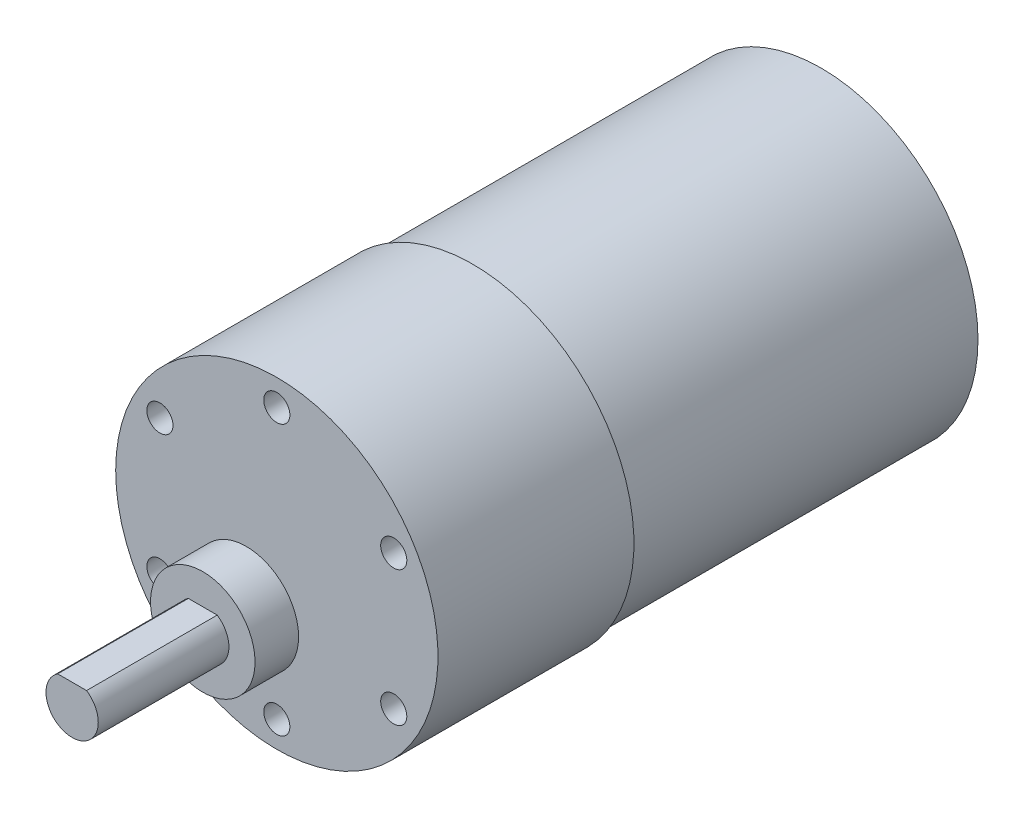
ISO-10303-21;
HEADER;
FILE_DESCRIPTION(('STEP AP214'),'2;1');
FILE_NAME('part.step','',(''),(''),'','','');
FILE_SCHEMA(('AUTOMOTIVE_DESIGN { 1 0 10303 214 1 1 1 1 }'));
ENDSEC;
DATA;
#1=APPLICATION_CONTEXT('core data for automotive mechanical design processes');
#2=APPLICATION_PROTOCOL_DEFINITION('international standard','automotive_design',2000,#1);
#3=PRODUCT_CONTEXT('',#1,'mechanical');
#4=PRODUCT('Part','Part','',(#3));
#5=PRODUCT_RELATED_PRODUCT_CATEGORY('part','',(#4));
#6=PRODUCT_DEFINITION_FORMATION('','',#4);
#7=PRODUCT_DEFINITION_CONTEXT('part definition',#1,'design');
#8=PRODUCT_DEFINITION('design','',#6,#7);
#9=PRODUCT_DEFINITION_SHAPE('','',#8);
#10=(LENGTH_UNIT() NAMED_UNIT(*) SI_UNIT(.MILLI.,.METRE.));
#11=(NAMED_UNIT(*) PLANE_ANGLE_UNIT() SI_UNIT($,.RADIAN.));
#12=(NAMED_UNIT(*) SI_UNIT($,.STERADIAN.) SOLID_ANGLE_UNIT());
#13=UNCERTAINTY_MEASURE_WITH_UNIT(LENGTH_MEASURE(1.E-05),#10,'distance_accuracy_value','');
#14=(GEOMETRIC_REPRESENTATION_CONTEXT(3) GLOBAL_UNCERTAINTY_ASSIGNED_CONTEXT((#13)) GLOBAL_UNIT_ASSIGNED_CONTEXT((#10,
#11,#12)) REPRESENTATION_CONTEXT('',''));
#15=CARTESIAN_POINT('',(0.,0.,0.));
#16=DIRECTION('',(0.,0.,1.));
#17=DIRECTION('',(1.,0.,0.));
#18=AXIS2_PLACEMENT_3D('',#15,#16,#17);
#19=CARTESIAN_POINT('',(-3.50000000000001,-6.06217782649107,27.5));
#20=DIRECTION('',(0.,0.,1.));
#21=DIRECTION('',(1.,0.,0.));
#22=AXIS2_PLACEMENT_3D('',#19,#20,#21);
#23=PLANE('',#22);
#24=CARTESIAN_POINT('',(-3.50000000000001,-6.06217782649107,27.5));
#25=DIRECTION('',(0.,0.,1.));
#26=DIRECTION('',(1.,0.,0.));
#27=AXIS2_PLACEMENT_3D('',#24,#25,#26);
#28=CIRCLE('',#27,6.);
#29=CARTESIAN_POINT('',(2.49999999999999,-6.06217782649107,27.5));
#30=VERTEX_POINT('',#29);
#31=EDGE_CURVE('E81',#30,#30,#28,.T.);
#32=ORIENTED_EDGE('',*,*,#31,.T.);
#33=EDGE_LOOP('',(#32));
#34=FACE_BOUND('',#33,.T.);
#35=DIRECTION('',(1.,0.,0.));
#36=VECTOR('',#35,1.);
#37=CARTESIAN_POINT('',(-3.50000000000001,-3.56217782649107,27.5));
#38=LINE('',#37,#36);
#39=CARTESIAN_POINT('',(-5.15831239517771,-3.56217782649107,27.5));
#40=VERTEX_POINT('',#39);
#41=CARTESIAN_POINT('',(-1.8416876048223,-3.56217782649107,27.5));
#42=VERTEX_POINT('',#41);
#43=EDGE_CURVE('E48',#40,#42,#38,.T.);
#44=ORIENTED_EDGE('',*,*,#43,.T.);
#45=CARTESIAN_POINT('',(-3.50000000000001,-6.06217782649107,27.5));
#46=DIRECTION('',(0.,0.,1.));
#47=DIRECTION('',(1.,0.,0.));
#48=AXIS2_PLACEMENT_3D('',#45,#46,#47);
#49=CIRCLE('',#48,3.);
#50=EDGE_CURVE('E11',#42,#40,#49,.F.);
#51=ORIENTED_EDGE('',*,*,#50,.T.);
#52=EDGE_LOOP('',(#44,#51));
#53=FACE_BOUND('',#52,.T.);
#54=ADVANCED_FACE('F39',(#34,#53),#23,.T.);
#55=CARTESIAN_POINT('',(0.,0.,-40.));
#56=DIRECTION('',(0.,0.,1.));
#57=DIRECTION('',(1.,0.,0.));
#58=AXIS2_PLACEMENT_3D('',#55,#56,#57);
#59=CYLINDRICAL_SURFACE('',#58,18.);
#60=CARTESIAN_POINT('',(0.,0.,-40.));
#61=DIRECTION('',(0.,0.,1.));
#62=DIRECTION('',(1.,0.,0.));
#63=AXIS2_PLACEMENT_3D('',#60,#61,#62);
#64=CIRCLE('',#63,18.);
#65=CARTESIAN_POINT('',(18.,0.,-40.));
#66=VERTEX_POINT('',#65);
#67=EDGE_CURVE('E94',#66,#66,#64,.T.);
#68=ORIENTED_EDGE('',*,*,#67,.T.);
#69=EDGE_LOOP('',(#68));
#70=FACE_BOUND('',#69,.T.);
#71=CARTESIAN_POINT('',(0.,0.,0.));
#72=DIRECTION('',(0.,0.,1.));
#73=DIRECTION('',(1.,0.,0.));
#74=AXIS2_PLACEMENT_3D('',#71,#72,#73);
#75=CIRCLE('',#74,18.);
#76=CARTESIAN_POINT('',(18.,0.,0.));
#77=VERTEX_POINT('',#76);
#78=EDGE_CURVE('E99',#77,#77,#75,.T.);
#79=ORIENTED_EDGE('',*,*,#78,.F.);
#80=EDGE_LOOP('',(#79));
#81=FACE_BOUND('',#80,.T.);
#82=ADVANCED_FACE('F41',(#70,#81),#59,.T.);
#83=CARTESIAN_POINT('',(0.,0.,-40.));
#84=DIRECTION('',(0.,0.,1.));
#85=DIRECTION('',(1.,0.,0.));
#86=AXIS2_PLACEMENT_3D('',#83,#84,#85);
#87=PLANE('',#86);
#88=ORIENTED_EDGE('',*,*,#67,.F.);
#89=EDGE_LOOP('',(#88));
#90=FACE_BOUND('',#89,.T.);
#91=ADVANCED_FACE('F116',(#90),#87,.F.);
#92=CARTESIAN_POINT('',(0.,0.,22.5));
#93=DIRECTION('',(0.,0.,-1.));
#94=DIRECTION('',(-1.,0.,0.));
#95=AXIS2_PLACEMENT_3D('',#92,#93,#94);
#96=CYLINDRICAL_SURFACE('',#95,18.5);
#97=CARTESIAN_POINT('',(0.,0.,22.5));
#98=DIRECTION('',(0.,0.,1.));
#99=DIRECTION('',(1.,0.,0.));
#100=AXIS2_PLACEMENT_3D('',#97,#98,#99);
#101=CIRCLE('',#100,18.5);
#102=CARTESIAN_POINT('',(-18.5,0.,22.5));
#103=VERTEX_POINT('',#102);
#104=EDGE_CURVE('E95',#103,#103,#101,.T.);
#105=CARTESIAN_POINT('',(0.,0.,0.));
#106=DIRECTION('',(0.,0.,1.));
#107=DIRECTION('',(1.,0.,0.));
#108=AXIS2_PLACEMENT_3D('',#105,#106,#107);
#109=CIRCLE('',#108,18.5);
#110=CARTESIAN_POINT('',(-18.5,0.,0.));
#111=VERTEX_POINT('',#110);
#112=EDGE_CURVE('E86',#111,#111,#109,.T.);
#113=CARTESIAN_POINT('',(-18.5,0.,22.5));
#114=CARTESIAN_POINT('',(-18.5,0.,22.265625));
#115=CARTESIAN_POINT('',(-18.5,0.,22.03125));
#116=CARTESIAN_POINT('',(-18.5,0.,21.5625));
#117=CARTESIAN_POINT('',(-18.5,0.,21.328125));
#118=CARTESIAN_POINT('',(-18.5,0.,20.859375));
#119=CARTESIAN_POINT('',(-18.5,0.,20.625));
#120=CARTESIAN_POINT('',(-18.5,0.,20.15625));
#121=CARTESIAN_POINT('',(-18.5,0.,19.921875));
#122=CARTESIAN_POINT('',(-18.5,0.,19.453125));
#123=CARTESIAN_POINT('',(-18.5,0.,19.21875));
#124=CARTESIAN_POINT('',(-18.5,0.,18.75));
#125=CARTESIAN_POINT('',(-18.5,0.,18.515625));
#126=CARTESIAN_POINT('',(-18.5,0.,18.046875));
#127=CARTESIAN_POINT('',(-18.5,0.,17.8125));
#128=CARTESIAN_POINT('',(-18.5,0.,17.34375));
#129=CARTESIAN_POINT('',(-18.5,0.,17.109375));
#130=CARTESIAN_POINT('',(-18.5,0.,16.640625));
#131=CARTESIAN_POINT('',(-18.5,0.,16.40625));
#132=CARTESIAN_POINT('',(-18.5,0.,15.9375));
#133=CARTESIAN_POINT('',(-18.5,0.,15.703125));
#134=CARTESIAN_POINT('',(-18.5,0.,15.234375));
#135=CARTESIAN_POINT('',(-18.5,0.,15.));
#136=CARTESIAN_POINT('',(-18.5,0.,14.53125));
#137=CARTESIAN_POINT('',(-18.5,0.,14.296875));
#138=CARTESIAN_POINT('',(-18.5,0.,13.828125));
#139=CARTESIAN_POINT('',(-18.5,0.,13.59375));
#140=CARTESIAN_POINT('',(-18.5,0.,13.125));
#141=CARTESIAN_POINT('',(-18.5,0.,12.890625));
#142=CARTESIAN_POINT('',(-18.5,0.,12.421875));
#143=CARTESIAN_POINT('',(-18.5,0.,12.1875));
#144=CARTESIAN_POINT('',(-18.5,0.,11.71875));
#145=CARTESIAN_POINT('',(-18.5,0.,11.484375));
#146=CARTESIAN_POINT('',(-18.5,0.,11.015625));
#147=CARTESIAN_POINT('',(-18.5,0.,10.78125));
#148=CARTESIAN_POINT('',(-18.5,0.,10.3125));
#149=CARTESIAN_POINT('',(-18.5,0.,10.078125));
#150=CARTESIAN_POINT('',(-18.5,0.,9.60937499999999));
#151=CARTESIAN_POINT('',(-18.5,0.,9.375));
#152=CARTESIAN_POINT('',(-18.5,0.,8.90625));
#153=CARTESIAN_POINT('',(-18.5,0.,8.671875));
#154=CARTESIAN_POINT('',(-18.5,0.,8.20312499999999));
#155=CARTESIAN_POINT('',(-18.5,0.,7.96874999999999));
#156=CARTESIAN_POINT('',(-18.5,0.,7.5));
#157=CARTESIAN_POINT('',(-18.5,0.,7.265625));
#158=CARTESIAN_POINT('',(-18.5,0.,6.796875));
#159=CARTESIAN_POINT('',(-18.5,0.,6.5625));
#160=CARTESIAN_POINT('',(-18.5,0.,6.09375));
#161=CARTESIAN_POINT('',(-18.5,0.,5.859375));
#162=CARTESIAN_POINT('',(-18.5,0.,5.390625));
#163=CARTESIAN_POINT('',(-18.5,0.,5.15625));
#164=CARTESIAN_POINT('',(-18.5,0.,4.6875));
#165=CARTESIAN_POINT('',(-18.5,0.,4.453125));
#166=CARTESIAN_POINT('',(-18.5,0.,3.984375));
#167=CARTESIAN_POINT('',(-18.5,0.,3.75));
#168=CARTESIAN_POINT('',(-18.5,0.,3.28125));
#169=CARTESIAN_POINT('',(-18.5,0.,3.046875));
#170=CARTESIAN_POINT('',(-18.5,0.,2.578125));
#171=CARTESIAN_POINT('',(-18.5,0.,2.34375));
#172=CARTESIAN_POINT('',(-18.5,0.,1.875));
#173=CARTESIAN_POINT('',(-18.5,0.,1.640625));
#174=CARTESIAN_POINT('',(-18.5,0.,1.171875));
#175=CARTESIAN_POINT('',(-18.5,0.,0.937499999999996));
#176=CARTESIAN_POINT('',(-18.5,0.,0.468749999999996));
#177=CARTESIAN_POINT('',(-18.5,0.,0.234374999999996));
#178=CARTESIAN_POINT('',(-18.5,0.,0.));
#179=B_SPLINE_CURVE_WITH_KNOTS('',3,(#113,#114,#115,#116,#117,#118,#119,#120,#121,#122,#123,
#124,#125,#126,#127,#128,#129,#130,#131,#132,#133,#134,#135,#136,#137,#138,#139,#140,#141,#142,
#143,#144,#145,#146,#147,#148,#149,#150,#151,#152,#153,#154,#155,#156,#157,#158,#159,#160,#161,
#162,#163,#164,#165,#166,#167,#168,#169,#170,#171,#172,#173,#174,#175,#176,#177,#178),
.UNSPECIFIED.,.F.,.F.,(4,2,2,2,2,2,2,2,2,2,2,2,2,2,2,2,2,2,2,2,2,2,2,2,2,2,2,2,2,2,2,2,4),(0.,
0.703125000000002,1.40625,2.109375,2.8125,3.515625,4.21875,4.921875,5.625,6.328125,7.03125,
7.734375,8.4375,9.140625,9.84375,10.546875,11.25,11.953125,12.65625,13.359375,14.0625,14.765625,
15.46875,16.171875,16.875,17.578125,18.28125,18.984375,19.6875,20.390625,21.09375,21.796875,
22.5),.UNSPECIFIED.);
#180=EDGE_CURVE('BSEAM129',#103,#111,#179,.T.);
#181=ORIENTED_EDGE('',*,*,#104,.F.);
#182=ORIENTED_EDGE('',*,*,#112,.T.);
#183=ORIENTED_EDGE('',*,*,#180,.T.);
#184=ORIENTED_EDGE('',*,*,#180,.F.);
#185=EDGE_LOOP('',(#181,#183,#182,#184));
#186=FACE_BOUND('',#185,.T.);
#187=ADVANCED_FACE('F129',(#186),#96,.T.);
#188=CARTESIAN_POINT('',(0.,0.,22.5));
#189=DIRECTION('',(0.,0.,1.));
#190=DIRECTION('',(1.,0.,0.));
#191=AXIS2_PLACEMENT_3D('',#188,#189,#190);
#192=PLANE('',#191);
#193=CARTESIAN_POINT('',(13.4233937586587,7.75000000000016,22.5));
#194=DIRECTION('',(0.,0.,1.));
#195=DIRECTION('',(0.50000000000001,-0.866025403784433,0.));
#196=AXIS2_PLACEMENT_3D('',#193,#194,#195);
#197=CIRCLE('',#196,1.5);
#198=CARTESIAN_POINT('',(14.1733937586587,6.45096189432351,22.5));
#199=VERTEX_POINT('',#198);
#200=EDGE_CURVE('E331',#199,#199,#197,.T.);
#201=ORIENTED_EDGE('',*,*,#200,.F.);
#202=EDGE_LOOP('',(#201));
#203=FACE_BOUND('',#202,.T.);
#204=CARTESIAN_POINT('',(13.4233937586589,-7.74999999999987,22.5));
#205=DIRECTION('',(0.,0.,1.));
#206=DIRECTION('',(-0.499999999999992,-0.866025403784443,0.));
#207=AXIS2_PLACEMENT_3D('',#204,#205,#206);
#208=CIRCLE('',#207,1.5);
#209=CARTESIAN_POINT('',(12.6733937586589,-9.04903810567654,22.5));
#210=VERTEX_POINT('',#209);
#211=EDGE_CURVE('E330',#210,#210,#208,.T.);
#212=ORIENTED_EDGE('',*,*,#211,.F.);
#213=EDGE_LOOP('',(#212));
#214=FACE_BOUND('',#213,.T.);
#215=CARTESIAN_POINT('',(0.,-15.5,22.5));
#216=DIRECTION('',(0.,0.,1.));
#217=DIRECTION('',(-1.,0.,0.));
#218=AXIS2_PLACEMENT_3D('',#215,#216,#217);
#219=CIRCLE('',#218,1.5);
#220=CARTESIAN_POINT('',(-1.5,-15.5,22.5));
#221=VERTEX_POINT('',#220);
#222=EDGE_CURVE('E376',#221,#221,#219,.T.);
#223=ORIENTED_EDGE('',*,*,#222,.F.);
#224=EDGE_LOOP('',(#223));
#225=FACE_BOUND('',#224,.T.);
#226=CARTESIAN_POINT('',(-13.4233937586588,-7.75000000000006,22.5));
#227=DIRECTION('',(0.,0.,1.));
#228=DIRECTION('',(-0.500000000000004,0.866025403784436,0.));
#229=AXIS2_PLACEMENT_3D('',#226,#227,#228);
#230=CIRCLE('',#229,1.5);
#231=CARTESIAN_POINT('',(-14.1733937586588,-6.45096189432341,22.5));
#232=VERTEX_POINT('',#231);
#233=EDGE_CURVE('E368',#232,#232,#230,.T.);
#234=ORIENTED_EDGE('',*,*,#233,.F.);
#235=EDGE_LOOP('',(#234));
#236=FACE_BOUND('',#235,.T.);
#237=CARTESIAN_POINT('',(-13.4233937586588,7.74999999999997,22.5));
#238=DIRECTION('',(0.,0.,1.));
#239=DIRECTION('',(0.499999999999998,0.86602540378444,0.));
#240=AXIS2_PLACEMENT_3D('',#237,#238,#239);
#241=CIRCLE('',#240,1.5);
#242=CARTESIAN_POINT('',(-12.6733937586588,9.04903810567663,22.5));
#243=VERTEX_POINT('',#242);
#244=EDGE_CURVE('E347',#243,#243,#241,.T.);
#245=ORIENTED_EDGE('',*,*,#244,.F.);
#246=EDGE_LOOP('',(#245));
#247=FACE_BOUND('',#246,.T.);
#248=CARTESIAN_POINT('',(0.,15.5,22.5));
#249=DIRECTION('',(0.,0.,1.));
#250=DIRECTION('',(1.,0.,0.));
#251=AXIS2_PLACEMENT_3D('',#248,#249,#250);
#252=CIRCLE('',#251,1.5);
#253=CARTESIAN_POINT('',(1.5,15.5,22.5));
#254=VERTEX_POINT('',#253);
#255=EDGE_CURVE('E346',#254,#254,#252,.T.);
#256=ORIENTED_EDGE('',*,*,#255,.F.);
#257=EDGE_LOOP('',(#256));
#258=FACE_BOUND('',#257,.T.);
#259=CARTESIAN_POINT('',(-3.50000000000001,-6.06217782649107,22.5));
#260=DIRECTION('',(0.,0.,1.));
#261=DIRECTION('',(1.,0.,0.));
#262=AXIS2_PLACEMENT_3D('',#259,#260,#261);
#263=CIRCLE('',#262,6.);
#264=CARTESIAN_POINT('',(2.49999999999999,-6.06217782649107,22.5));
#265=VERTEX_POINT('',#264);
#266=EDGE_CURVE('E90',#265,#265,#263,.T.);
#267=ORIENTED_EDGE('',*,*,#266,.F.);
#268=EDGE_LOOP('',(#267));
#269=FACE_BOUND('',#268,.T.);
#270=ORIENTED_EDGE('',*,*,#104,.T.);
#271=EDGE_LOOP('',(#270));
#272=FACE_BOUND('',#271,.T.);
#273=ADVANCED_FACE('F126',(#203,#214,#225,#236,#247,#258,#269,#272),#192,.T.);
#274=CARTESIAN_POINT('',(0.,0.,0.));
#275=DIRECTION('',(0.,0.,1.));
#276=DIRECTION('',(1.,0.,0.));
#277=AXIS2_PLACEMENT_3D('',#274,#275,#276);
#278=PLANE('',#277);
#279=ORIENTED_EDGE('',*,*,#78,.T.);
#280=EDGE_LOOP('',(#279));
#281=FACE_BOUND('',#280,.T.);
#282=ORIENTED_EDGE('',*,*,#112,.F.);
#283=EDGE_LOOP('',(#282));
#284=FACE_BOUND('',#283,.T.);
#285=ADVANCED_FACE('F124',(#281,#284),#278,.F.);
#286=CARTESIAN_POINT('',(-3.50000000000001,-6.06217782649107,27.5));
#287=DIRECTION('',(0.,0.,-1.));
#288=DIRECTION('',(-1.,0.,0.));
#289=AXIS2_PLACEMENT_3D('',#286,#287,#288);
#290=CYLINDRICAL_SURFACE('',#289,6.);
#291=ORIENTED_EDGE('',*,*,#31,.F.);
#292=EDGE_LOOP('',(#291));
#293=FACE_BOUND('',#292,.T.);
#294=ORIENTED_EDGE('',*,*,#266,.T.);
#295=EDGE_LOOP('',(#294));
#296=FACE_BOUND('',#295,.T.);
#297=ADVANCED_FACE('F121',(#293,#296),#290,.T.);
#298=CARTESIAN_POINT('',(-3.50000000000001,-6.06217782649107,42.5));
#299=DIRECTION('',(0.,0.,-1.));
#300=DIRECTION('',(-1.,0.,0.));
#301=AXIS2_PLACEMENT_3D('',#298,#299,#300);
#302=CYLINDRICAL_SURFACE('',#301,3.);
#303=ORIENTED_EDGE('',*,*,#50,.F.);
#304=DIRECTION('',(0.,0.,-1.));
#305=VECTOR('',#304,1.);
#306=CARTESIAN_POINT('',(-1.8416876048223,-3.56217782649107,42.5));
#307=LINE('',#306,#305);
#308=CARTESIAN_POINT('',(-1.8416876048223,-3.56217782649107,42.5));
#309=VERTEX_POINT('',#308);
#310=EDGE_CURVE('E55',#309,#42,#307,.T.);
#311=ORIENTED_EDGE('',*,*,#310,.F.);
#312=CARTESIAN_POINT('',(-3.50000000000001,-6.06217782649107,42.5));
#313=DIRECTION('',(0.,0.,1.));
#314=DIRECTION('',(1.,0.,0.));
#315=AXIS2_PLACEMENT_3D('',#312,#313,#314);
#316=CIRCLE('',#315,3.);
#317=CARTESIAN_POINT('',(-5.15831239517771,-3.56217782649107,42.5));
#318=VERTEX_POINT('',#317);
#319=EDGE_CURVE('E72',#318,#309,#316,.T.);
#320=ORIENTED_EDGE('',*,*,#319,.F.);
#321=DIRECTION('',(0.,0.,-1.));
#322=VECTOR('',#321,1.);
#323=CARTESIAN_POINT('',(-5.15831239517771,-3.56217782649107,42.5));
#324=LINE('',#323,#322);
#325=EDGE_CURVE('E68',#318,#40,#324,.T.);
#326=ORIENTED_EDGE('',*,*,#325,.T.);
#327=EDGE_LOOP('',(#303,#311,#320,#326));
#328=FACE_BOUND('',#327,.T.);
#329=ADVANCED_FACE('F79',(#328),#302,.T.);
#330=CARTESIAN_POINT('',(-1.8416876048223,-3.56217782649107,42.5));
#331=DIRECTION('',(0.,-1.,0.));
#332=DIRECTION('',(0.,0.,-1.));
#333=AXIS2_PLACEMENT_3D('',#330,#331,#332);
#334=PLANE('',#333);
#335=ORIENTED_EDGE('',*,*,#43,.F.);
#336=ORIENTED_EDGE('',*,*,#325,.F.);
#337=DIRECTION('',(-1.,0.,0.));
#338=VECTOR('',#337,1.);
#339=CARTESIAN_POINT('',(-1.8416876048223,-3.56217782649107,42.5));
#340=LINE('',#339,#338);
#341=EDGE_CURVE('E65',#309,#318,#340,.T.);
#342=ORIENTED_EDGE('',*,*,#341,.F.);
#343=ORIENTED_EDGE('',*,*,#310,.T.);
#344=EDGE_LOOP('',(#335,#336,#342,#343));
#345=FACE_BOUND('',#344,.T.);
#346=ADVANCED_FACE('F67',(#345),#334,.F.);
#347=CARTESIAN_POINT('',(-3.50000000000001,-6.06217782649107,42.5));
#348=DIRECTION('',(0.,0.,1.));
#349=DIRECTION('',(1.,0.,0.));
#350=AXIS2_PLACEMENT_3D('',#347,#348,#349);
#351=PLANE('',#350);
#352=ORIENTED_EDGE('',*,*,#319,.T.);
#353=ORIENTED_EDGE('',*,*,#341,.T.);
#354=EDGE_LOOP('',(#352,#353));
#355=FACE_BOUND('',#354,.T.);
#356=ADVANCED_FACE('F74',(#355),#351,.T.);
#357=CARTESIAN_POINT('',(0.,15.5,17.5));
#358=DIRECTION('',(0.,0.,1.));
#359=DIRECTION('',(1.,0.,0.));
#360=AXIS2_PLACEMENT_3D('',#357,#358,#359);
#361=CYLINDRICAL_SURFACE('',#360,1.5);
#362=CARTESIAN_POINT('',(0.,15.5,17.5));
#363=DIRECTION('',(0.,0.,1.));
#364=DIRECTION('',(1.,0.,0.));
#365=AXIS2_PLACEMENT_3D('',#362,#363,#364);
#366=CIRCLE('',#365,1.5);
#367=CARTESIAN_POINT('',(1.5,15.5,17.5));
#368=VERTEX_POINT('',#367);
#369=EDGE_CURVE('E77',#368,#368,#366,.T.);
#370=ORIENTED_EDGE('',*,*,#369,.F.);
#371=EDGE_LOOP('',(#370));
#372=FACE_BOUND('',#371,.T.);
#373=ORIENTED_EDGE('',*,*,#255,.T.);
#374=EDGE_LOOP('',(#373));
#375=FACE_BOUND('',#374,.T.);
#376=ADVANCED_FACE('F182',(#372,#375),#361,.F.);
#377=CARTESIAN_POINT('',(0.,15.5,17.5));
#378=DIRECTION('',(0.,0.,1.));
#379=DIRECTION('',(1.,0.,0.));
#380=AXIS2_PLACEMENT_3D('',#377,#378,#379);
#381=PLANE('',#380);
#382=ORIENTED_EDGE('',*,*,#369,.T.);
#383=EDGE_LOOP('',(#382));
#384=FACE_BOUND('',#383,.T.);
#385=ADVANCED_FACE('F189',(#384),#381,.T.);
#386=CARTESIAN_POINT('',(-13.4233937586588,7.74999999999997,17.5));
#387=DIRECTION('',(0.,0.,1.));
#388=DIRECTION('',(1.,0.,0.));
#389=AXIS2_PLACEMENT_3D('',#386,#387,#388);
#390=CYLINDRICAL_SURFACE('',#389,1.5);
#391=CARTESIAN_POINT('',(-13.4233937586588,7.74999999999997,17.5));
#392=DIRECTION('',(0.,0.,1.));
#393=DIRECTION('',(0.499999999999998,0.86602540378444,0.));
#394=AXIS2_PLACEMENT_3D('',#391,#392,#393);
#395=CIRCLE('',#394,1.5);
#396=CARTESIAN_POINT('',(-12.6733937586588,9.04903810567663,17.5));
#397=VERTEX_POINT('',#396);
#398=EDGE_CURVE('E342',#397,#397,#395,.T.);
#399=ORIENTED_EDGE('',*,*,#398,.F.);
#400=EDGE_LOOP('',(#399));
#401=FACE_BOUND('',#400,.T.);
#402=ORIENTED_EDGE('',*,*,#244,.T.);
#403=EDGE_LOOP('',(#402));
#404=FACE_BOUND('',#403,.T.);
#405=ADVANCED_FACE('F196',(#401,#404),#390,.F.);
#406=CARTESIAN_POINT('',(-13.4233937586588,7.74999999999997,17.5));
#407=DIRECTION('',(0.,0.,1.));
#408=DIRECTION('',(0.499999999999998,0.86602540378444,0.));
#409=AXIS2_PLACEMENT_3D('',#406,#407,#408);
#410=PLANE('',#409);
#411=ORIENTED_EDGE('',*,*,#398,.T.);
#412=EDGE_LOOP('',(#411));
#413=FACE_BOUND('',#412,.T.);
#414=ADVANCED_FACE('F203',(#413),#410,.T.);
#415=CARTESIAN_POINT('',(-13.4233937586588,-7.75000000000006,17.5));
#416=DIRECTION('',(0.,0.,1.));
#417=DIRECTION('',(1.,0.,0.));
#418=AXIS2_PLACEMENT_3D('',#415,#416,#417);
#419=CYLINDRICAL_SURFACE('',#418,1.5);
#420=CARTESIAN_POINT('',(-13.4233937586588,-7.75000000000006,17.5));
#421=DIRECTION('',(0.,0.,1.));
#422=DIRECTION('',(-0.500000000000004,0.866025403784436,0.));
#423=AXIS2_PLACEMENT_3D('',#420,#421,#422);
#424=CIRCLE('',#423,1.5);
#425=CARTESIAN_POINT('',(-14.1733937586588,-6.45096189432341,17.5));
#426=VERTEX_POINT('',#425);
#427=EDGE_CURVE('E351',#426,#426,#424,.T.);
#428=ORIENTED_EDGE('',*,*,#427,.F.);
#429=EDGE_LOOP('',(#428));
#430=FACE_BOUND('',#429,.T.);
#431=ORIENTED_EDGE('',*,*,#233,.T.);
#432=EDGE_LOOP('',(#431));
#433=FACE_BOUND('',#432,.T.);
#434=ADVANCED_FACE('F211',(#430,#433),#419,.F.);
#435=CARTESIAN_POINT('',(-13.4233937586588,-7.75000000000006,17.5));
#436=DIRECTION('',(0.,0.,1.));
#437=DIRECTION('',(-0.500000000000004,0.866025403784436,0.));
#438=AXIS2_PLACEMENT_3D('',#435,#436,#437);
#439=PLANE('',#438);
#440=ORIENTED_EDGE('',*,*,#427,.T.);
#441=EDGE_LOOP('',(#440));
#442=FACE_BOUND('',#441,.T.);
#443=ADVANCED_FACE('F219',(#442),#439,.T.);
#444=CARTESIAN_POINT('',(0.,-15.5,17.5));
#445=DIRECTION('',(0.,0.,1.));
#446=DIRECTION('',(1.,0.,0.));
#447=AXIS2_PLACEMENT_3D('',#444,#445,#446);
#448=CYLINDRICAL_SURFACE('',#447,1.5);
#449=CARTESIAN_POINT('',(0.,-15.5,17.5));
#450=DIRECTION('',(0.,0.,1.));
#451=DIRECTION('',(-1.,0.,0.));
#452=AXIS2_PLACEMENT_3D('',#449,#450,#451);
#453=CIRCLE('',#452,1.5);
#454=CARTESIAN_POINT('',(-1.5,-15.5,17.5));
#455=VERTEX_POINT('',#454);
#456=EDGE_CURVE('E372',#455,#455,#453,.T.);
#457=ORIENTED_EDGE('',*,*,#456,.F.);
#458=EDGE_LOOP('',(#457));
#459=FACE_BOUND('',#458,.T.);
#460=ORIENTED_EDGE('',*,*,#222,.T.);
#461=EDGE_LOOP('',(#460));
#462=FACE_BOUND('',#461,.T.);
#463=ADVANCED_FACE('F227',(#459,#462),#448,.F.);
#464=CARTESIAN_POINT('',(0.,-15.5,17.5));
#465=DIRECTION('',(0.,0.,1.));
#466=DIRECTION('',(-1.,0.,0.));
#467=AXIS2_PLACEMENT_3D('',#464,#465,#466);
#468=PLANE('',#467);
#469=ORIENTED_EDGE('',*,*,#456,.T.);
#470=EDGE_LOOP('',(#469));
#471=FACE_BOUND('',#470,.T.);
#472=ADVANCED_FACE('F235',(#471),#468,.T.);
#473=CARTESIAN_POINT('',(13.4233937586589,-7.74999999999987,17.5));
#474=DIRECTION('',(0.,0.,1.));
#475=DIRECTION('',(1.,0.,0.));
#476=AXIS2_PLACEMENT_3D('',#473,#474,#475);
#477=CYLINDRICAL_SURFACE('',#476,1.5);
#478=CARTESIAN_POINT('',(13.4233937586589,-7.74999999999987,17.5));
#479=DIRECTION('',(0.,0.,1.));
#480=DIRECTION('',(-0.499999999999992,-0.866025403784443,0.));
#481=AXIS2_PLACEMENT_3D('',#478,#479,#480);
#482=CIRCLE('',#481,1.5);
#483=CARTESIAN_POINT('',(12.6733937586589,-9.04903810567654,17.5));
#484=VERTEX_POINT('',#483);
#485=EDGE_CURVE('E336',#484,#484,#482,.T.);
#486=ORIENTED_EDGE('',*,*,#485,.F.);
#487=EDGE_LOOP('',(#486));
#488=FACE_BOUND('',#487,.T.);
#489=ORIENTED_EDGE('',*,*,#211,.T.);
#490=EDGE_LOOP('',(#489));
#491=FACE_BOUND('',#490,.T.);
#492=ADVANCED_FACE('F243',(#488,#491),#477,.F.);
#493=CARTESIAN_POINT('',(13.4233937586589,-7.74999999999987,17.5));
#494=DIRECTION('',(0.,0.,1.));
#495=DIRECTION('',(-0.499999999999992,-0.866025403784443,0.));
#496=AXIS2_PLACEMENT_3D('',#493,#494,#495);
#497=PLANE('',#496);
#498=ORIENTED_EDGE('',*,*,#485,.T.);
#499=EDGE_LOOP('',(#498));
#500=FACE_BOUND('',#499,.T.);
#501=ADVANCED_FACE('F251',(#500),#497,.T.);
#502=CARTESIAN_POINT('',(13.4233937586587,7.75000000000016,17.5));
#503=DIRECTION('',(0.,0.,1.));
#504=DIRECTION('',(1.,0.,0.));
#505=AXIS2_PLACEMENT_3D('',#502,#503,#504);
#506=CYLINDRICAL_SURFACE('',#505,1.5);
#507=CARTESIAN_POINT('',(13.4233937586587,7.75000000000016,17.5));
#508=DIRECTION('',(0.,0.,1.));
#509=DIRECTION('',(0.50000000000001,-0.866025403784433,0.));
#510=AXIS2_PLACEMENT_3D('',#507,#508,#509);
#511=CIRCLE('',#510,1.5);
#512=CARTESIAN_POINT('',(14.1733937586587,6.45096189432351,17.5));
#513=VERTEX_POINT('',#512);
#514=EDGE_CURVE('E328',#513,#513,#511,.T.);
#515=ORIENTED_EDGE('',*,*,#514,.F.);
#516=EDGE_LOOP('',(#515));
#517=FACE_BOUND('',#516,.T.);
#518=ORIENTED_EDGE('',*,*,#200,.T.);
#519=EDGE_LOOP('',(#518));
#520=FACE_BOUND('',#519,.T.);
#521=ADVANCED_FACE('F259',(#517,#520),#506,.F.);
#522=CARTESIAN_POINT('',(13.4233937586587,7.75000000000016,17.5));
#523=DIRECTION('',(0.,0.,1.));
#524=DIRECTION('',(0.50000000000001,-0.866025403784433,0.));
#525=AXIS2_PLACEMENT_3D('',#522,#523,#524);
#526=PLANE('',#525);
#527=ORIENTED_EDGE('',*,*,#514,.T.);
#528=EDGE_LOOP('',(#527));
#529=FACE_BOUND('',#528,.T.);
#530=ADVANCED_FACE('F267',(#529),#526,.T.);
#531=CLOSED_SHELL('',(#54,#82,#91,#187,#273,#285,#297,#329,#346,#356,#376,#385,#405,#414,#434,
#443,#463,#472,#492,#501,#521,#530));
#532=MANIFOLD_SOLID_BREP('B2',#531);
#533=ADVANCED_BREP_SHAPE_REPRESENTATION('',(#18,#532),#14);
#534=SHAPE_DEFINITION_REPRESENTATION(#9,#533);
ENDSEC;
END-ISO-10303-21;
